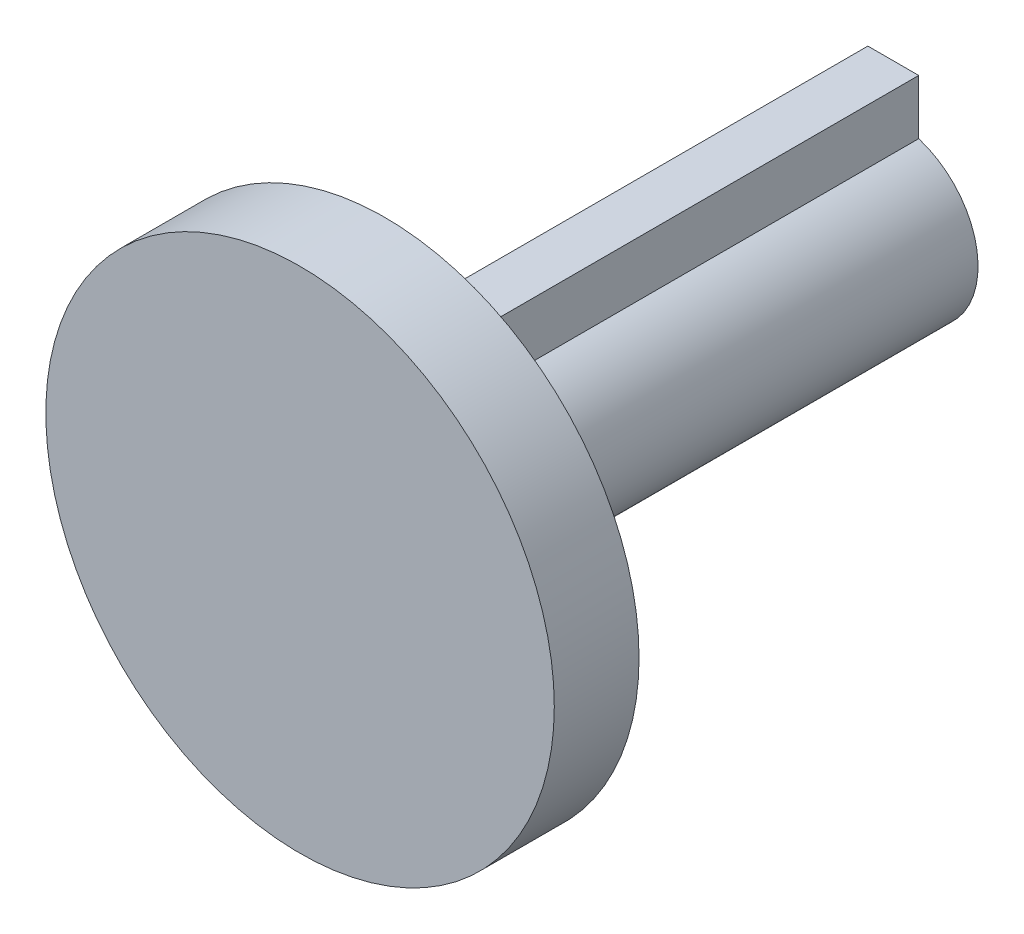
ISO-10303-21;
HEADER;
FILE_DESCRIPTION(('STEP AP214'),'2;1');
FILE_NAME('part.step','',(''),(''),'','','');
FILE_SCHEMA(('AUTOMOTIVE_DESIGN { 1 0 10303 214 1 1 1 1 }'));
ENDSEC;
DATA;
#1=APPLICATION_CONTEXT('core data for automotive mechanical design processes');
#2=APPLICATION_PROTOCOL_DEFINITION('international standard','automotive_design',2000,#1);
#3=PRODUCT_CONTEXT('',#1,'mechanical');
#4=PRODUCT('Part','Part','',(#3));
#5=PRODUCT_RELATED_PRODUCT_CATEGORY('part','',(#4));
#6=PRODUCT_DEFINITION_FORMATION('','',#4);
#7=PRODUCT_DEFINITION_CONTEXT('part definition',#1,'design');
#8=PRODUCT_DEFINITION('design','',#6,#7);
#9=PRODUCT_DEFINITION_SHAPE('','',#8);
#10=(LENGTH_UNIT() NAMED_UNIT(*) SI_UNIT(.MILLI.,.METRE.));
#11=(NAMED_UNIT(*) PLANE_ANGLE_UNIT() SI_UNIT($,.RADIAN.));
#12=(NAMED_UNIT(*) SI_UNIT($,.STERADIAN.) SOLID_ANGLE_UNIT());
#13=UNCERTAINTY_MEASURE_WITH_UNIT(LENGTH_MEASURE(1.E-05),#10,'distance_accuracy_value','');
#14=(GEOMETRIC_REPRESENTATION_CONTEXT(3) GLOBAL_UNCERTAINTY_ASSIGNED_CONTEXT((#13)) GLOBAL_UNIT_ASSIGNED_CONTEXT((#10,
#11,#12)) REPRESENTATION_CONTEXT('',''));
#15=CARTESIAN_POINT('',(0.,0.,0.));
#16=DIRECTION('',(0.,0.,1.));
#17=DIRECTION('',(1.,0.,0.));
#18=AXIS2_PLACEMENT_3D('',#15,#16,#17);
#19=CARTESIAN_POINT('',(-1.5,0.,30.));
#20=DIRECTION('',(-1.,0.,0.));
#21=DIRECTION('',(0.,0.,1.));
#22=AXIS2_PLACEMENT_3D('',#19,#20,#21);
#23=PLANE('',#22);
#24=DIRECTION('',(0.,1.,0.));
#25=VECTOR('',#24,1.);
#26=CARTESIAN_POINT('',(-1.5,0.,0.));
#27=LINE('',#26,#25);
#28=CARTESIAN_POINT('',(-1.5,4.76969600708473,0.));
#29=VERTEX_POINT('',#28);
#30=CARTESIAN_POINT('',(-1.5,8.,0.));
#31=VERTEX_POINT('',#30);
#32=EDGE_CURVE('E94',#29,#31,#27,.T.);
#33=ORIENTED_EDGE('',*,*,#32,.F.);
#34=DIRECTION('',(0.,0.,-1.));
#35=VECTOR('',#34,1.);
#36=CARTESIAN_POINT('',(-1.5,4.76969600708473,30.));
#37=LINE('',#36,#35);
#38=CARTESIAN_POINT('',(-1.5,4.76969600708473,30.));
#39=VERTEX_POINT('',#38);
#40=EDGE_CURVE('E11',#39,#29,#37,.T.);
#41=ORIENTED_EDGE('',*,*,#40,.F.);
#42=DIRECTION('',(0.,1.,0.));
#43=VECTOR('',#42,1.);
#44=CARTESIAN_POINT('',(-1.5,0.,30.));
#45=LINE('',#44,#43);
#46=CARTESIAN_POINT('',(-1.5,8.,30.));
#47=VERTEX_POINT('',#46);
#48=EDGE_CURVE('E95',#39,#47,#45,.T.);
#49=ORIENTED_EDGE('',*,*,#48,.T.);
#50=DIRECTION('',(0.,0.,-1.));
#51=VECTOR('',#50,1.);
#52=CARTESIAN_POINT('',(-1.5,8.,30.));
#53=LINE('',#52,#51);
#54=EDGE_CURVE('E80',#47,#31,#53,.T.);
#55=ORIENTED_EDGE('',*,*,#54,.T.);
#56=EDGE_LOOP('',(#33,#41,#49,#55));
#57=FACE_BOUND('',#56,.T.);
#58=ADVANCED_FACE('F41',(#57),#23,.T.);
#59=CARTESIAN_POINT('',(0.,0.,30.));
#60=DIRECTION('',(0.,0.,-1.));
#61=DIRECTION('',(-1.,0.,0.));
#62=AXIS2_PLACEMENT_3D('',#59,#60,#61);
#63=CYLINDRICAL_SURFACE('',#62,5.);
#64=CARTESIAN_POINT('',(0.,0.,0.));
#65=DIRECTION('',(0.,0.,1.));
#66=DIRECTION('',(1.,0.,0.));
#67=AXIS2_PLACEMENT_3D('',#64,#65,#66);
#68=CIRCLE('',#67,5.);
#69=CARTESIAN_POINT('',(1.5,4.76969600708473,0.));
#70=VERTEX_POINT('',#69);
#71=EDGE_CURVE('E89',#29,#70,#68,.T.);
#72=ORIENTED_EDGE('',*,*,#71,.T.);
#73=DIRECTION('',(0.,0.,-1.));
#74=VECTOR('',#73,1.);
#75=CARTESIAN_POINT('',(1.5,4.76969600708473,30.));
#76=LINE('',#75,#74);
#77=CARTESIAN_POINT('',(1.5,4.76969600708473,30.));
#78=VERTEX_POINT('',#77);
#79=EDGE_CURVE('E49',#78,#70,#76,.T.);
#80=ORIENTED_EDGE('',*,*,#79,.F.);
#81=CARTESIAN_POINT('',(0.,0.,30.));
#82=DIRECTION('',(0.,0.,1.));
#83=DIRECTION('',(1.,0.,0.));
#84=AXIS2_PLACEMENT_3D('',#81,#82,#83);
#85=CIRCLE('',#84,5.);
#86=EDGE_CURVE('E98',#39,#78,#85,.T.);
#87=ORIENTED_EDGE('',*,*,#86,.F.);
#88=ORIENTED_EDGE('',*,*,#40,.T.);
#89=EDGE_LOOP('',(#72,#80,#87,#88));
#90=FACE_BOUND('',#89,.T.);
#91=ADVANCED_FACE('F109',(#90),#63,.T.);
#92=CARTESIAN_POINT('',(1.5,0.,30.));
#93=DIRECTION('',(1.,0.,0.));
#94=DIRECTION('',(0.,0.,-1.));
#95=AXIS2_PLACEMENT_3D('',#92,#93,#94);
#96=PLANE('',#95);
#97=DIRECTION('',(0.,-1.,0.));
#98=VECTOR('',#97,1.);
#99=CARTESIAN_POINT('',(1.5,0.,0.));
#100=LINE('',#99,#98);
#101=CARTESIAN_POINT('',(1.5,8.,0.));
#102=VERTEX_POINT('',#101);
#103=EDGE_CURVE('E83',#102,#70,#100,.T.);
#104=ORIENTED_EDGE('',*,*,#103,.F.);
#105=DIRECTION('',(0.,0.,-1.));
#106=VECTOR('',#105,1.);
#107=CARTESIAN_POINT('',(1.5,8.,30.));
#108=LINE('',#107,#106);
#109=CARTESIAN_POINT('',(1.5,8.,30.));
#110=VERTEX_POINT('',#109);
#111=EDGE_CURVE('E72',#110,#102,#108,.T.);
#112=ORIENTED_EDGE('',*,*,#111,.F.);
#113=DIRECTION('',(0.,-1.,0.));
#114=VECTOR('',#113,1.);
#115=CARTESIAN_POINT('',(1.5,0.,30.));
#116=LINE('',#115,#114);
#117=EDGE_CURVE('E56',#110,#78,#116,.T.);
#118=ORIENTED_EDGE('',*,*,#117,.T.);
#119=ORIENTED_EDGE('',*,*,#79,.T.);
#120=EDGE_LOOP('',(#104,#112,#118,#119));
#121=FACE_BOUND('',#120,.T.);
#122=ADVANCED_FACE('F84',(#121),#96,.T.);
#123=CARTESIAN_POINT('',(0.,8.,30.));
#124=DIRECTION('',(0.,1.,0.));
#125=DIRECTION('',(0.,0.,1.));
#126=AXIS2_PLACEMENT_3D('',#123,#124,#125);
#127=PLANE('',#126);
#128=DIRECTION('',(1.,0.,0.));
#129=VECTOR('',#128,1.);
#130=CARTESIAN_POINT('',(0.,8.,0.));
#131=LINE('',#130,#129);
#132=EDGE_CURVE('E77',#31,#102,#131,.T.);
#133=ORIENTED_EDGE('',*,*,#132,.F.);
#134=ORIENTED_EDGE('',*,*,#54,.F.);
#135=DIRECTION('',(1.,0.,0.));
#136=VECTOR('',#135,1.);
#137=CARTESIAN_POINT('',(0.,8.,30.));
#138=LINE('',#137,#136);
#139=EDGE_CURVE('E78',#47,#110,#138,.T.);
#140=ORIENTED_EDGE('',*,*,#139,.T.);
#141=ORIENTED_EDGE('',*,*,#111,.T.);
#142=EDGE_LOOP('',(#133,#134,#140,#141));
#143=FACE_BOUND('',#142,.T.);
#144=ADVANCED_FACE('F74',(#143),#127,.T.);
#145=CARTESIAN_POINT('',(0.,0.,0.));
#146=DIRECTION('',(0.,0.,1.));
#147=DIRECTION('',(1.,0.,0.));
#148=AXIS2_PLACEMENT_3D('',#145,#146,#147);
#149=PLANE('',#148);
#150=ORIENTED_EDGE('',*,*,#32,.T.);
#151=ORIENTED_EDGE('',*,*,#132,.T.);
#152=ORIENTED_EDGE('',*,*,#103,.T.);
#153=ORIENTED_EDGE('',*,*,#71,.F.);
#154=EDGE_LOOP('',(#150,#151,#152,#153));
#155=FACE_BOUND('',#154,.T.);
#156=ADVANCED_FACE('F92',(#155),#149,.F.);
#157=CARTESIAN_POINT('',(0.,0.,35.));
#158=DIRECTION('',(0.,0.,-1.));
#159=DIRECTION('',(-1.,0.,0.));
#160=AXIS2_PLACEMENT_3D('',#157,#158,#159);
#161=CYLINDRICAL_SURFACE('',#160,15.);
#162=CARTESIAN_POINT('',(0.,0.,35.));
#163=DIRECTION('',(0.,0.,1.));
#164=DIRECTION('',(1.,0.,0.));
#165=AXIS2_PLACEMENT_3D('',#162,#163,#164);
#166=CIRCLE('',#165,15.);
#167=CARTESIAN_POINT('',(15.,0.,35.));
#168=VERTEX_POINT('',#167);
#169=EDGE_CURVE('E107',#168,#168,#166,.T.);
#170=ORIENTED_EDGE('',*,*,#169,.F.);
#171=EDGE_LOOP('',(#170));
#172=FACE_BOUND('',#171,.T.);
#173=CARTESIAN_POINT('',(0.,0.,30.));
#174=DIRECTION('',(0.,0.,1.));
#175=DIRECTION('',(1.,0.,0.));
#176=AXIS2_PLACEMENT_3D('',#173,#174,#175);
#177=CIRCLE('',#176,15.);
#178=CARTESIAN_POINT('',(15.,0.,30.));
#179=VERTEX_POINT('',#178);
#180=EDGE_CURVE('E116',#179,#179,#177,.T.);
#181=ORIENTED_EDGE('',*,*,#180,.T.);
#182=EDGE_LOOP('',(#181));
#183=FACE_BOUND('',#182,.T.);
#184=ADVANCED_FACE('F124',(#172,#183),#161,.T.);
#185=CARTESIAN_POINT('',(0.,0.,35.));
#186=DIRECTION('',(0.,0.,1.));
#187=DIRECTION('',(1.,0.,0.));
#188=AXIS2_PLACEMENT_3D('',#185,#186,#187);
#189=PLANE('',#188);
#190=ORIENTED_EDGE('',*,*,#169,.T.);
#191=EDGE_LOOP('',(#190));
#192=FACE_BOUND('',#191,.T.);
#193=ADVANCED_FACE('F122',(#192),#189,.T.);
#194=CARTESIAN_POINT('',(0.,0.,30.));
#195=DIRECTION('',(0.,0.,1.));
#196=DIRECTION('',(1.,0.,0.));
#197=AXIS2_PLACEMENT_3D('',#194,#195,#196);
#198=PLANE('',#197);
#199=ORIENTED_EDGE('',*,*,#48,.F.);
#200=ORIENTED_EDGE('',*,*,#86,.T.);
#201=ORIENTED_EDGE('',*,*,#117,.F.);
#202=ORIENTED_EDGE('',*,*,#139,.F.);
#203=EDGE_LOOP('',(#199,#200,#201,#202));
#204=FACE_BOUND('',#203,.T.);
#205=ORIENTED_EDGE('',*,*,#180,.F.);
#206=EDGE_LOOP('',(#205));
#207=FACE_BOUND('',#206,.T.);
#208=ADVANCED_FACE('F130',(#204,#207),#198,.F.);
#209=CLOSED_SHELL('',(#58,#91,#122,#144,#156,#184,#193,#208));
#210=MANIFOLD_SOLID_BREP('B2',#209);
#211=ADVANCED_BREP_SHAPE_REPRESENTATION('',(#18,#210),#14);
#212=SHAPE_DEFINITION_REPRESENTATION(#9,#211);
ENDSEC;
END-ISO-10303-21;
